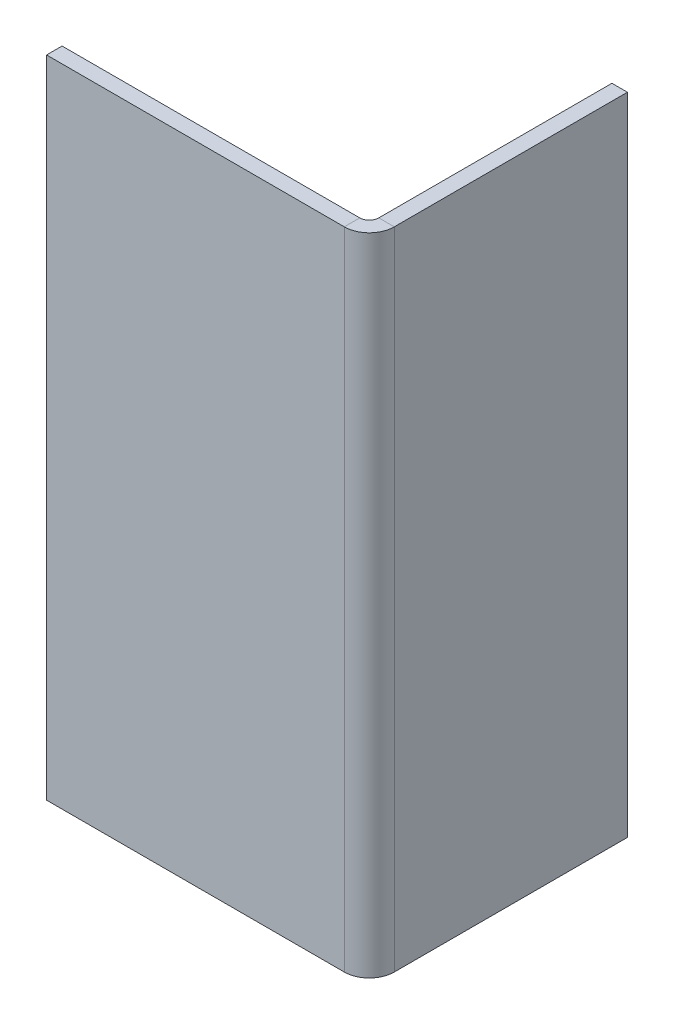
ISO-10303-21;
HEADER;
FILE_DESCRIPTION(('STEP AP214'),'2;1');
FILE_NAME('part.step','',(''),(''),'','','');
FILE_SCHEMA(('AUTOMOTIVE_DESIGN { 1 0 10303 214 1 1 1 1 }'));
ENDSEC;
DATA;
#1=APPLICATION_CONTEXT('core data for automotive mechanical design processes');
#2=APPLICATION_PROTOCOL_DEFINITION('international standard','automotive_design',2000,#1);
#3=PRODUCT_CONTEXT('',#1,'mechanical');
#4=PRODUCT('Part','Part','',(#3));
#5=PRODUCT_RELATED_PRODUCT_CATEGORY('part','',(#4));
#6=PRODUCT_DEFINITION_FORMATION('','',#4);
#7=PRODUCT_DEFINITION_CONTEXT('part definition',#1,'design');
#8=PRODUCT_DEFINITION('design','',#6,#7);
#9=PRODUCT_DEFINITION_SHAPE('','',#8);
#10=(LENGTH_UNIT() NAMED_UNIT(*) SI_UNIT(.MILLI.,.METRE.));
#11=(NAMED_UNIT(*) PLANE_ANGLE_UNIT() SI_UNIT($,.RADIAN.));
#12=(NAMED_UNIT(*) SI_UNIT($,.STERADIAN.) SOLID_ANGLE_UNIT());
#13=UNCERTAINTY_MEASURE_WITH_UNIT(LENGTH_MEASURE(1.E-05),#10,'distance_accuracy_value','');
#14=(GEOMETRIC_REPRESENTATION_CONTEXT(3) GLOBAL_UNCERTAINTY_ASSIGNED_CONTEXT((#13)) GLOBAL_UNIT_ASSIGNED_CONTEXT((#10,
#11,#12)) REPRESENTATION_CONTEXT('',''));
#15=CARTESIAN_POINT('',(0.,0.,0.));
#16=DIRECTION('',(0.,0.,1.));
#17=DIRECTION('',(1.,0.,0.));
#18=AXIS2_PLACEMENT_3D('',#15,#16,#17);
#19=CARTESIAN_POINT('',(0.,0.,-1.2));
#20=DIRECTION('',(0.,-1.,0.));
#21=DIRECTION('',(0.,0.,-1.));
#22=AXIS2_PLACEMENT_3D('',#19,#20,#21);
#23=PLANE('',#22);
#24=DIRECTION('',(1.,0.,0.));
#25=VECTOR('',#24,1.);
#26=CARTESIAN_POINT('',(0.,0.,-1.2));
#27=LINE('',#26,#25);
#28=CARTESIAN_POINT('',(0.,0.,-1.2));
#29=VERTEX_POINT('',#28);
#30=CARTESIAN_POINT('',(23.0634,0.,-1.2));
#31=VERTEX_POINT('',#30);
#32=EDGE_CURVE('E190',#29,#31,#27,.T.);
#33=ORIENTED_EDGE('',*,*,#32,.T.);
#34=DIRECTION('',(0.,0.,1.));
#35=VECTOR('',#34,1.);
#36=CARTESIAN_POINT('',(23.0634,0.,-1.2));
#37=LINE('',#36,#35);
#38=CARTESIAN_POINT('',(23.0634,0.,0.));
#39=VERTEX_POINT('',#38);
#40=EDGE_CURVE('E174',#31,#39,#37,.T.);
#41=ORIENTED_EDGE('',*,*,#40,.T.);
#42=DIRECTION('',(1.,0.,0.));
#43=VECTOR('',#42,1.);
#44=CARTESIAN_POINT('',(0.,0.,0.));
#45=LINE('',#44,#43);
#46=CARTESIAN_POINT('',(0.,0.,0.));
#47=VERTEX_POINT('',#46);
#48=EDGE_CURVE('E197',#47,#39,#45,.T.);
#49=ORIENTED_EDGE('',*,*,#48,.F.);
#50=DIRECTION('',(0.,0.,1.));
#51=VECTOR('',#50,1.);
#52=CARTESIAN_POINT('',(0.,0.,-1.2));
#53=LINE('',#52,#51);
#54=EDGE_CURVE('E63',#29,#47,#53,.T.);
#55=ORIENTED_EDGE('',*,*,#54,.F.);
#56=EDGE_LOOP('',(#33,#41,#49,#55));
#57=FACE_BOUND('',#56,.T.);
#58=ADVANCED_FACE('F59',(#57),#23,.T.);
#59=CARTESIAN_POINT('',(0.,0.,-1.2));
#60=DIRECTION('',(0.,0.,-1.));
#61=DIRECTION('',(-1.,0.,0.));
#62=AXIS2_PLACEMENT_3D('',#59,#60,#61);
#63=PLANE('',#62);
#64=DIRECTION('',(-1.,0.,0.));
#65=VECTOR('',#64,1.);
#66=CARTESIAN_POINT('',(0.,50.,-1.2));
#67=LINE('',#66,#65);
#68=CARTESIAN_POINT('',(23.0634,50.,-1.2));
#69=VERTEX_POINT('',#68);
#70=CARTESIAN_POINT('',(0.,50.,-1.2));
#71=VERTEX_POINT('',#70);
#72=EDGE_CURVE('E193',#69,#71,#67,.T.);
#73=ORIENTED_EDGE('',*,*,#72,.F.);
#74=DIRECTION('',(0.,-1.,0.));
#75=VECTOR('',#74,1.);
#76=CARTESIAN_POINT('',(23.0634,0.,-1.2));
#77=LINE('',#76,#75);
#78=EDGE_CURVE('E74',#31,#69,#77,.F.);
#79=ORIENTED_EDGE('',*,*,#78,.F.);
#80=ORIENTED_EDGE('',*,*,#32,.F.);
#81=DIRECTION('',(0.,-1.,0.));
#82=VECTOR('',#81,1.);
#83=CARTESIAN_POINT('',(0.,0.,-1.2));
#84=LINE('',#83,#82);
#85=EDGE_CURVE('E187',#71,#29,#84,.T.);
#86=ORIENTED_EDGE('',*,*,#85,.F.);
#87=EDGE_LOOP('',(#73,#79,#80,#86));
#88=FACE_BOUND('',#87,.T.);
#89=ADVANCED_FACE('F239',(#88),#63,.T.);
#90=CARTESIAN_POINT('',(0.,0.,0.));
#91=DIRECTION('',(0.,0.,-1.));
#92=DIRECTION('',(-1.,0.,0.));
#93=AXIS2_PLACEMENT_3D('',#90,#91,#92);
#94=PLANE('',#93);
#95=DIRECTION('',(0.,-1.,0.));
#96=VECTOR('',#95,1.);
#97=CARTESIAN_POINT('',(23.0634,0.,0.));
#98=LINE('',#97,#96);
#99=CARTESIAN_POINT('',(23.0634,50.,0.));
#100=VERTEX_POINT('',#99);
#101=EDGE_CURVE('E168',#39,#100,#98,.F.);
#102=ORIENTED_EDGE('',*,*,#101,.T.);
#103=DIRECTION('',(-1.,0.,0.));
#104=VECTOR('',#103,1.);
#105=CARTESIAN_POINT('',(0.,50.,0.));
#106=LINE('',#105,#104);
#107=CARTESIAN_POINT('',(0.,50.,0.));
#108=VERTEX_POINT('',#107);
#109=EDGE_CURVE('E191',#100,#108,#106,.T.);
#110=ORIENTED_EDGE('',*,*,#109,.T.);
#111=DIRECTION('',(0.,-1.,0.));
#112=VECTOR('',#111,1.);
#113=CARTESIAN_POINT('',(0.,0.,0.));
#114=LINE('',#113,#112);
#115=EDGE_CURVE('E185',#108,#47,#114,.T.);
#116=ORIENTED_EDGE('',*,*,#115,.T.);
#117=ORIENTED_EDGE('',*,*,#48,.T.);
#118=EDGE_LOOP('',(#102,#110,#116,#117));
#119=FACE_BOUND('',#118,.T.);
#120=ADVANCED_FACE('F201',(#119),#94,.F.);
#121=CARTESIAN_POINT('',(0.,0.,-1.2));
#122=DIRECTION('',(-1.,0.,0.));
#123=DIRECTION('',(0.,0.,1.));
#124=AXIS2_PLACEMENT_3D('',#121,#122,#123);
#125=PLANE('',#124);
#126=ORIENTED_EDGE('',*,*,#115,.F.);
#127=DIRECTION('',(0.,0.,1.));
#128=VECTOR('',#127,1.);
#129=CARTESIAN_POINT('',(0.,50.,-1.2));
#130=LINE('',#129,#128);
#131=EDGE_CURVE('E13',#71,#108,#130,.T.);
#132=ORIENTED_EDGE('',*,*,#131,.F.);
#133=ORIENTED_EDGE('',*,*,#85,.T.);
#134=ORIENTED_EDGE('',*,*,#54,.T.);
#135=EDGE_LOOP('',(#126,#132,#133,#134));
#136=FACE_BOUND('',#135,.T.);
#137=ADVANCED_FACE('F61',(#136),#125,.T.);
#138=CARTESIAN_POINT('',(0.,50.,-1.2));
#139=DIRECTION('',(0.,1.,0.));
#140=DIRECTION('',(0.,0.,1.));
#141=AXIS2_PLACEMENT_3D('',#138,#139,#140);
#142=PLANE('',#141);
#143=DIRECTION('',(0.,0.,1.));
#144=VECTOR('',#143,1.);
#145=CARTESIAN_POINT('',(23.0634,50.,-1.2));
#146=LINE('',#145,#144);
#147=EDGE_CURVE('E82',#69,#100,#146,.T.);
#148=ORIENTED_EDGE('',*,*,#147,.F.);
#149=ORIENTED_EDGE('',*,*,#72,.T.);
#150=ORIENTED_EDGE('',*,*,#131,.T.);
#151=ORIENTED_EDGE('',*,*,#109,.F.);
#152=EDGE_LOOP('',(#148,#149,#150,#151));
#153=FACE_BOUND('',#152,.T.);
#154=ADVANCED_FACE('F205',(#153),#142,.T.);
#155=CARTESIAN_POINT('',(23.0634,50.,-1.9366));
#156=DIRECTION('',(0.,1.,0.));
#157=DIRECTION('',(0.,0.,1.));
#158=AXIS2_PLACEMENT_3D('',#155,#156,#157);
#159=PLANE('',#158);
#160=DIRECTION('',(-1.,0.,0.));
#161=VECTOR('',#160,1.);
#162=CARTESIAN_POINT('',(25.,50.,-1.93659999999999));
#163=LINE('',#162,#161);
#164=CARTESIAN_POINT('',(23.8,50.,-1.9366));
#165=VERTEX_POINT('',#164);
#166=CARTESIAN_POINT('',(25.,50.,-1.93659999999999));
#167=VERTEX_POINT('',#166);
#168=EDGE_CURVE('E150',#165,#167,#163,.F.);
#169=ORIENTED_EDGE('',*,*,#168,.F.);
#170=CARTESIAN_POINT('',(23.0634,50.,-1.9366));
#171=DIRECTION('',(0.,-1.,0.));
#172=DIRECTION('',(0.,0.,-1.));
#173=AXIS2_PLACEMENT_3D('',#170,#171,#172);
#174=CIRCLE('',#173,0.7366);
#175=EDGE_CURVE('E177',#69,#165,#174,.F.);
#176=ORIENTED_EDGE('',*,*,#175,.F.);
#177=ORIENTED_EDGE('',*,*,#147,.T.);
#178=CARTESIAN_POINT('',(23.0634,50.,-1.9366));
#179=DIRECTION('',(0.,-1.,0.));
#180=DIRECTION('',(0.,0.,-1.));
#181=AXIS2_PLACEMENT_3D('',#178,#179,#180);
#182=CIRCLE('',#181,1.9366);
#183=EDGE_CURVE('E170',#100,#167,#182,.F.);
#184=ORIENTED_EDGE('',*,*,#183,.T.);
#185=EDGE_LOOP('',(#169,#176,#177,#184));
#186=FACE_BOUND('',#185,.T.);
#187=ADVANCED_FACE('F228',(#186),#159,.T.);
#188=CARTESIAN_POINT('',(23.0634,0.,-1.9366));
#189=DIRECTION('',(0.,1.,0.));
#190=DIRECTION('',(0.,0.,1.));
#191=AXIS2_PLACEMENT_3D('',#188,#189,#190);
#192=PLANE('',#191);
#193=CARTESIAN_POINT('',(23.0634,0.,-1.9366));
#194=DIRECTION('',(0.,-1.,0.));
#195=DIRECTION('',(0.,0.,-1.));
#196=AXIS2_PLACEMENT_3D('',#193,#194,#195);
#197=CIRCLE('',#196,0.7366);
#198=CARTESIAN_POINT('',(23.8,0.,-1.9366));
#199=VERTEX_POINT('',#198);
#200=EDGE_CURVE('E181',#199,#31,#197,.T.);
#201=ORIENTED_EDGE('',*,*,#200,.F.);
#202=DIRECTION('',(-1.,0.,0.));
#203=VECTOR('',#202,1.);
#204=CARTESIAN_POINT('',(23.8,0.,-1.9366));
#205=LINE('',#204,#203);
#206=CARTESIAN_POINT('',(25.,0.,-1.93659999999999));
#207=VERTEX_POINT('',#206);
#208=EDGE_CURVE('E162',#199,#207,#205,.F.);
#209=ORIENTED_EDGE('',*,*,#208,.T.);
#210=CARTESIAN_POINT('',(23.0634,0.,-1.9366));
#211=DIRECTION('',(0.,-1.,0.));
#212=DIRECTION('',(0.,0.,-1.));
#213=AXIS2_PLACEMENT_3D('',#210,#211,#212);
#214=CIRCLE('',#213,1.9366);
#215=EDGE_CURVE('E171',#207,#39,#214,.T.);
#216=ORIENTED_EDGE('',*,*,#215,.T.);
#217=ORIENTED_EDGE('',*,*,#40,.F.);
#218=EDGE_LOOP('',(#201,#209,#216,#217));
#219=FACE_BOUND('',#218,.T.);
#220=ADVANCED_FACE('F216',(#219),#192,.F.);
#221=CARTESIAN_POINT('',(23.0634,0.,-1.9366));
#222=DIRECTION('',(0.,-1.,0.));
#223=DIRECTION('',(1.,0.,0.));
#224=AXIS2_PLACEMENT_3D('',#221,#222,#223);
#225=CYLINDRICAL_SURFACE('',#224,1.9366);
#226=ORIENTED_EDGE('',*,*,#101,.F.);
#227=ORIENTED_EDGE('',*,*,#215,.F.);
#228=DIRECTION('',(0.,-1.,0.));
#229=VECTOR('',#228,1.);
#230=CARTESIAN_POINT('',(25.,50.,-1.93659999999999));
#231=LINE('',#230,#229);
#232=EDGE_CURVE('E160',#207,#167,#231,.F.);
#233=ORIENTED_EDGE('',*,*,#232,.T.);
#234=ORIENTED_EDGE('',*,*,#183,.F.);
#235=EDGE_LOOP('',(#226,#227,#233,#234));
#236=FACE_BOUND('',#235,.T.);
#237=ADVANCED_FACE('F213',(#236),#225,.T.);
#238=CARTESIAN_POINT('',(23.0634,0.,-1.9366));
#239=DIRECTION('',(0.,-1.,0.));
#240=DIRECTION('',(1.,0.,0.));
#241=AXIS2_PLACEMENT_3D('',#238,#239,#240);
#242=CYLINDRICAL_SURFACE('',#241,0.7366);
#243=ORIENTED_EDGE('',*,*,#78,.T.);
#244=ORIENTED_EDGE('',*,*,#175,.T.);
#245=DIRECTION('',(0.,-1.,0.));
#246=VECTOR('',#245,1.);
#247=CARTESIAN_POINT('',(23.8,50.,-1.9366));
#248=LINE('',#247,#246);
#249=EDGE_CURVE('E165',#165,#199,#248,.T.);
#250=ORIENTED_EDGE('',*,*,#249,.T.);
#251=ORIENTED_EDGE('',*,*,#200,.T.);
#252=EDGE_LOOP('',(#243,#244,#250,#251));
#253=FACE_BOUND('',#252,.T.);
#254=ADVANCED_FACE('F225',(#253),#242,.F.);
#255=CARTESIAN_POINT('',(25.0000000000001,0.,-20.));
#256=DIRECTION('',(0.,1.,0.));
#257=DIRECTION('',(0.,0.,1.));
#258=AXIS2_PLACEMENT_3D('',#255,#256,#257);
#259=PLANE('',#258);
#260=ORIENTED_EDGE('',*,*,#208,.F.);
#261=DIRECTION('',(0.,0.,1.));
#262=VECTOR('',#261,1.);
#263=CARTESIAN_POINT('',(23.8000000000001,0.,-20.));
#264=LINE('',#263,#262);
#265=CARTESIAN_POINT('',(23.8000000000001,0.,-20.));
#266=VERTEX_POINT('',#265);
#267=EDGE_CURVE('E158',#199,#266,#264,.F.);
#268=ORIENTED_EDGE('',*,*,#267,.T.);
#269=DIRECTION('',(-1.,0.,0.));
#270=VECTOR('',#269,1.);
#271=CARTESIAN_POINT('',(25.0000000000001,0.,-20.));
#272=LINE('',#271,#270);
#273=CARTESIAN_POINT('',(25.0000000000001,0.,-20.));
#274=VERTEX_POINT('',#273);
#275=EDGE_CURVE('E146',#274,#266,#272,.T.);
#276=ORIENTED_EDGE('',*,*,#275,.F.);
#277=DIRECTION('',(0.,0.,-1.));
#278=VECTOR('',#277,1.);
#279=CARTESIAN_POINT('',(25.,0.,0.));
#280=LINE('',#279,#278);
#281=EDGE_CURVE('E133',#207,#274,#280,.T.);
#282=ORIENTED_EDGE('',*,*,#281,.F.);
#283=EDGE_LOOP('',(#260,#268,#276,#282));
#284=FACE_BOUND('',#283,.T.);
#285=ADVANCED_FACE('F220',(#284),#259,.F.);
#286=CARTESIAN_POINT('',(25.,50.,-1.2));
#287=DIRECTION('',(0.,-1.,0.));
#288=DIRECTION('',(0.,0.,-1.));
#289=AXIS2_PLACEMENT_3D('',#286,#287,#288);
#290=PLANE('',#289);
#291=ORIENTED_EDGE('',*,*,#168,.T.);
#292=DIRECTION('',(0.,0.,1.));
#293=VECTOR('',#292,1.);
#294=CARTESIAN_POINT('',(25.,50.,0.));
#295=LINE('',#294,#293);
#296=CARTESIAN_POINT('',(25.0000000000001,50.,-20.));
#297=VERTEX_POINT('',#296);
#298=EDGE_CURVE('E131',#297,#167,#295,.T.);
#299=ORIENTED_EDGE('',*,*,#298,.F.);
#300=DIRECTION('',(-1.,0.,0.));
#301=VECTOR('',#300,1.);
#302=CARTESIAN_POINT('',(25.0000000000001,50.,-20.));
#303=LINE('',#302,#301);
#304=CARTESIAN_POINT('',(23.8000000000001,50.,-20.));
#305=VERTEX_POINT('',#304);
#306=EDGE_CURVE('E139',#297,#305,#303,.T.);
#307=ORIENTED_EDGE('',*,*,#306,.T.);
#308=DIRECTION('',(0.,0.,-1.));
#309=VECTOR('',#308,1.);
#310=CARTESIAN_POINT('',(23.8,50.,-1.2));
#311=LINE('',#310,#309);
#312=EDGE_CURVE('E155',#305,#165,#311,.F.);
#313=ORIENTED_EDGE('',*,*,#312,.T.);
#314=EDGE_LOOP('',(#291,#299,#307,#313));
#315=FACE_BOUND('',#314,.T.);
#316=ADVANCED_FACE('F149',(#315),#290,.F.);
#317=CARTESIAN_POINT('',(25.,0.,0.));
#318=DIRECTION('',(-1.,0.,0.));
#319=DIRECTION('',(0.,0.,1.));
#320=AXIS2_PLACEMENT_3D('',#317,#318,#319);
#321=PLANE('',#320);
#322=ORIENTED_EDGE('',*,*,#232,.F.);
#323=ORIENTED_EDGE('',*,*,#281,.T.);
#324=DIRECTION('',(0.,1.,0.));
#325=VECTOR('',#324,1.);
#326=CARTESIAN_POINT('',(25.0000000000001,0.,-20.));
#327=LINE('',#326,#325);
#328=EDGE_CURVE('E126',#274,#297,#327,.T.);
#329=ORIENTED_EDGE('',*,*,#328,.T.);
#330=ORIENTED_EDGE('',*,*,#298,.T.);
#331=EDGE_LOOP('',(#322,#323,#329,#330));
#332=FACE_BOUND('',#331,.T.);
#333=ADVANCED_FACE('F129',(#332),#321,.F.);
#334=CARTESIAN_POINT('',(23.8,0.,0.));
#335=DIRECTION('',(-1.,0.,0.));
#336=DIRECTION('',(0.,0.,1.));
#337=AXIS2_PLACEMENT_3D('',#334,#335,#336);
#338=PLANE('',#337);
#339=ORIENTED_EDGE('',*,*,#267,.F.);
#340=ORIENTED_EDGE('',*,*,#249,.F.);
#341=ORIENTED_EDGE('',*,*,#312,.F.);
#342=DIRECTION('',(0.,-1.,0.));
#343=VECTOR('',#342,1.);
#344=CARTESIAN_POINT('',(23.8000000000001,50.,-20.));
#345=LINE('',#344,#343);
#346=EDGE_CURVE('E142',#266,#305,#345,.F.);
#347=ORIENTED_EDGE('',*,*,#346,.F.);
#348=EDGE_LOOP('',(#339,#340,#341,#347));
#349=FACE_BOUND('',#348,.T.);
#350=ADVANCED_FACE('F223',(#349),#338,.T.);
#351=CARTESIAN_POINT('',(25.0000000000001,50.,-20.));
#352=DIRECTION('',(0.,0.,1.));
#353=DIRECTION('',(1.,0.,0.));
#354=AXIS2_PLACEMENT_3D('',#351,#352,#353);
#355=PLANE('',#354);
#356=ORIENTED_EDGE('',*,*,#346,.T.);
#357=ORIENTED_EDGE('',*,*,#306,.F.);
#358=ORIENTED_EDGE('',*,*,#328,.F.);
#359=ORIENTED_EDGE('',*,*,#275,.T.);
#360=EDGE_LOOP('',(#356,#357,#358,#359));
#361=FACE_BOUND('',#360,.T.);
#362=ADVANCED_FACE('F140',(#361),#355,.F.);
#363=CLOSED_SHELL('',(#58,#89,#120,#137,#154,#187,#220,#237,#254,#285,#316,#333,#350,#362));
#364=MANIFOLD_SOLID_BREP('B2',#363);
#365=ADVANCED_BREP_SHAPE_REPRESENTATION('',(#18,#364),#14);
#366=SHAPE_DEFINITION_REPRESENTATION(#9,#365);
ENDSEC;
END-ISO-10303-21;
